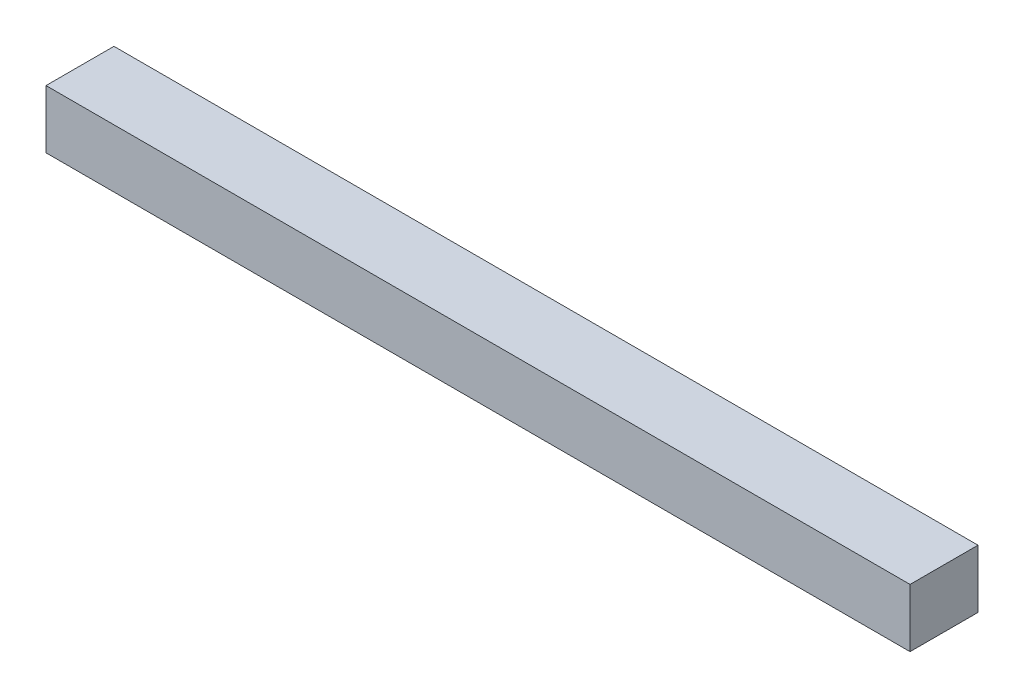
ISO-10303-21;
HEADER;
FILE_DESCRIPTION(('STEP AP214'),'2;1');
FILE_NAME('part.step','',(''),(''),'','','');
FILE_SCHEMA(('AUTOMOTIVE_DESIGN { 1 0 10303 214 1 1 1 1 }'));
ENDSEC;
DATA;
#1=APPLICATION_CONTEXT('core data for automotive mechanical design processes');
#2=APPLICATION_PROTOCOL_DEFINITION('international standard','automotive_design',2000,#1);
#3=PRODUCT_CONTEXT('',#1,'mechanical');
#4=PRODUCT('Part','Part','',(#3));
#5=PRODUCT_RELATED_PRODUCT_CATEGORY('part','',(#4));
#6=PRODUCT_DEFINITION_FORMATION('','',#4);
#7=PRODUCT_DEFINITION_CONTEXT('part definition',#1,'design');
#8=PRODUCT_DEFINITION('design','',#6,#7);
#9=PRODUCT_DEFINITION_SHAPE('','',#8);
#10=(LENGTH_UNIT() NAMED_UNIT(*) SI_UNIT(.MILLI.,.METRE.));
#11=(NAMED_UNIT(*) PLANE_ANGLE_UNIT() SI_UNIT($,.RADIAN.));
#12=(NAMED_UNIT(*) SI_UNIT($,.STERADIAN.) SOLID_ANGLE_UNIT());
#13=UNCERTAINTY_MEASURE_WITH_UNIT(LENGTH_MEASURE(1.E-05),#10,'distance_accuracy_value','');
#14=(GEOMETRIC_REPRESENTATION_CONTEXT(3) GLOBAL_UNCERTAINTY_ASSIGNED_CONTEXT((#13)) GLOBAL_UNIT_ASSIGNED_CONTEXT((#10,
#11,#12)) REPRESENTATION_CONTEXT('',''));
#15=CARTESIAN_POINT('',(0.,0.,0.));
#16=DIRECTION('',(0.,0.,1.));
#17=DIRECTION('',(1.,0.,0.));
#18=AXIS2_PLACEMENT_3D('',#15,#16,#17);
#19=CARTESIAN_POINT('',(262.47000879404,-3.23558340860733,79.7621896811064));
#20=DIRECTION('',(-1.,0.,0.));
#21=DIRECTION('',(0.,0.,1.));
#22=AXIS2_PLACEMENT_3D('',#19,#20,#21);
#23=PLANE('',#22);
#24=DIRECTION('',(0.,-1.,0.));
#25=VECTOR('',#24,1.);
#26=CARTESIAN_POINT('',(262.47000879404,-3.23558340860733,86.7621896811064));
#27=LINE('',#26,#25);
#28=CARTESIAN_POINT('',(262.47000879404,-3.23558340860733,86.7621896811064));
#29=VERTEX_POINT('',#28);
#30=CARTESIAN_POINT('',(262.47000879404,-9.23558340860733,86.7621896811064));
#31=VERTEX_POINT('',#30);
#32=EDGE_CURVE('E90',#29,#31,#27,.T.);
#33=ORIENTED_EDGE('',*,*,#32,.T.);
#34=DIRECTION('',(0.,0.,-1.));
#35=VECTOR('',#34,1.);
#36=CARTESIAN_POINT('',(262.47000879404,-9.23558340860733,79.7621896811064));
#37=LINE('',#36,#35);
#38=CARTESIAN_POINT('',(262.47000879404,-9.23558340860733,79.7621896811064));
#39=VERTEX_POINT('',#38);
#40=EDGE_CURVE('E85',#31,#39,#37,.T.);
#41=ORIENTED_EDGE('',*,*,#40,.T.);
#42=DIRECTION('',(0.,-1.,0.));
#43=VECTOR('',#42,1.);
#44=CARTESIAN_POINT('',(262.47000879404,-3.23558340860733,79.7621896811064));
#45=LINE('',#44,#43);
#46=CARTESIAN_POINT('',(262.47000879404,-3.23558340860733,79.7621896811064));
#47=VERTEX_POINT('',#46);
#48=EDGE_CURVE('E11',#47,#39,#45,.T.);
#49=ORIENTED_EDGE('',*,*,#48,.F.);
#50=DIRECTION('',(0.,0.,-1.));
#51=VECTOR('',#50,1.);
#52=CARTESIAN_POINT('',(262.47000879404,-3.23558340860733,79.7621896811064));
#53=LINE('',#52,#51);
#54=EDGE_CURVE('E96',#29,#47,#53,.T.);
#55=ORIENTED_EDGE('',*,*,#54,.F.);
#56=EDGE_LOOP('',(#33,#41,#49,#55));
#57=FACE_BOUND('',#56,.T.);
#58=ADVANCED_FACE('F33',(#57),#23,.F.);
#59=CARTESIAN_POINT('',(262.47000879404,-3.23558340860733,79.7621896811064));
#60=DIRECTION('',(0.,0.,1.));
#61=DIRECTION('',(1.,0.,0.));
#62=AXIS2_PLACEMENT_3D('',#59,#60,#61);
#63=PLANE('',#62);
#64=ORIENTED_EDGE('',*,*,#48,.T.);
#65=DIRECTION('',(-1.,0.,0.));
#66=VECTOR('',#65,1.);
#67=CARTESIAN_POINT('',(262.47000879404,-9.23558340860733,79.7621896811064));
#68=LINE('',#67,#66);
#69=CARTESIAN_POINT('',(173.47000879404,-9.23558340860733,79.7621896811065));
#70=VERTEX_POINT('',#69);
#71=EDGE_CURVE('E75',#39,#70,#68,.T.);
#72=ORIENTED_EDGE('',*,*,#71,.T.);
#73=DIRECTION('',(0.,-1.,0.));
#74=VECTOR('',#73,1.);
#75=CARTESIAN_POINT('',(173.47000879404,-3.23558340860733,79.7621896811065));
#76=LINE('',#75,#74);
#77=CARTESIAN_POINT('',(173.47000879404,-3.23558340860733,79.7621896811065));
#78=VERTEX_POINT('',#77);
#79=EDGE_CURVE('E40',#78,#70,#76,.T.);
#80=ORIENTED_EDGE('',*,*,#79,.F.);
#81=DIRECTION('',(-1.,0.,0.));
#82=VECTOR('',#81,1.);
#83=CARTESIAN_POINT('',(262.47000879404,-3.23558340860733,79.7621896811064));
#84=LINE('',#83,#82);
#85=EDGE_CURVE('E76',#47,#78,#84,.T.);
#86=ORIENTED_EDGE('',*,*,#85,.F.);
#87=EDGE_LOOP('',(#64,#72,#80,#86));
#88=FACE_BOUND('',#87,.T.);
#89=ADVANCED_FACE('F73',(#88),#63,.F.);
#90=CARTESIAN_POINT('',(173.47000879404,-3.23558340860733,79.7621896811065));
#91=DIRECTION('',(1.,0.,0.));
#92=DIRECTION('',(0.,0.,-1.));
#93=AXIS2_PLACEMENT_3D('',#90,#91,#92);
#94=PLANE('',#93);
#95=ORIENTED_EDGE('',*,*,#79,.T.);
#96=DIRECTION('',(0.,0.,1.));
#97=VECTOR('',#96,1.);
#98=CARTESIAN_POINT('',(173.47000879404,-9.23558340860733,79.7621896811065));
#99=LINE('',#98,#97);
#100=CARTESIAN_POINT('',(173.47000879404,-9.23558340860733,86.7621896811064));
#101=VERTEX_POINT('',#100);
#102=EDGE_CURVE('E88',#70,#101,#99,.T.);
#103=ORIENTED_EDGE('',*,*,#102,.T.);
#104=DIRECTION('',(0.,-1.,0.));
#105=VECTOR('',#104,1.);
#106=CARTESIAN_POINT('',(173.47000879404,-3.23558340860733,86.7621896811064));
#107=LINE('',#106,#105);
#108=CARTESIAN_POINT('',(173.47000879404,-3.23558340860733,86.7621896811064));
#109=VERTEX_POINT('',#108);
#110=EDGE_CURVE('E102',#109,#101,#107,.T.);
#111=ORIENTED_EDGE('',*,*,#110,.F.);
#112=DIRECTION('',(0.,0.,1.));
#113=VECTOR('',#112,1.);
#114=CARTESIAN_POINT('',(173.47000879404,-3.23558340860733,79.7621896811065));
#115=LINE('',#114,#113);
#116=EDGE_CURVE('E52',#78,#109,#115,.T.);
#117=ORIENTED_EDGE('',*,*,#116,.F.);
#118=EDGE_LOOP('',(#95,#103,#111,#117));
#119=FACE_BOUND('',#118,.T.);
#120=ADVANCED_FACE('F104',(#119),#94,.F.);
#121=CARTESIAN_POINT('',(262.47000879404,-3.23558340860733,86.7621896811064));
#122=DIRECTION('',(0.,0.,-1.));
#123=DIRECTION('',(-1.,0.,0.));
#124=AXIS2_PLACEMENT_3D('',#121,#122,#123);
#125=PLANE('',#124);
#126=ORIENTED_EDGE('',*,*,#110,.T.);
#127=DIRECTION('',(1.,0.,0.));
#128=VECTOR('',#127,1.);
#129=CARTESIAN_POINT('',(262.47000879404,-9.23558340860733,86.7621896811064));
#130=LINE('',#129,#128);
#131=EDGE_CURVE('E94',#101,#31,#130,.T.);
#132=ORIENTED_EDGE('',*,*,#131,.T.);
#133=ORIENTED_EDGE('',*,*,#32,.F.);
#134=DIRECTION('',(1.,0.,0.));
#135=VECTOR('',#134,1.);
#136=CARTESIAN_POINT('',(262.47000879404,-3.23558340860733,86.7621896811064));
#137=LINE('',#136,#135);
#138=EDGE_CURVE('E47',#109,#29,#137,.T.);
#139=ORIENTED_EDGE('',*,*,#138,.F.);
#140=EDGE_LOOP('',(#126,#132,#133,#139));
#141=FACE_BOUND('',#140,.T.);
#142=ADVANCED_FACE('F106',(#141),#125,.F.);
#143=CARTESIAN_POINT('',(0.,-3.23558340860733,0.));
#144=DIRECTION('',(0.,-1.,0.));
#145=DIRECTION('',(0.,0.,-1.));
#146=AXIS2_PLACEMENT_3D('',#143,#144,#145);
#147=PLANE('',#146);
#148=ORIENTED_EDGE('',*,*,#54,.T.);
#149=ORIENTED_EDGE('',*,*,#85,.T.);
#150=ORIENTED_EDGE('',*,*,#116,.T.);
#151=ORIENTED_EDGE('',*,*,#138,.T.);
#152=EDGE_LOOP('',(#148,#149,#150,#151));
#153=FACE_BOUND('',#152,.T.);
#154=ADVANCED_FACE('F107',(#153),#147,.F.);
#155=CARTESIAN_POINT('',(0.,-9.23558340860733,0.));
#156=DIRECTION('',(0.,-1.,0.));
#157=DIRECTION('',(0.,0.,-1.));
#158=AXIS2_PLACEMENT_3D('',#155,#156,#157);
#159=PLANE('',#158);
#160=ORIENTED_EDGE('',*,*,#40,.F.);
#161=ORIENTED_EDGE('',*,*,#131,.F.);
#162=ORIENTED_EDGE('',*,*,#102,.F.);
#163=ORIENTED_EDGE('',*,*,#71,.F.);
#164=EDGE_LOOP('',(#160,#161,#162,#163));
#165=FACE_BOUND('',#164,.T.);
#166=ADVANCED_FACE('F83',(#165),#159,.T.);
#167=CLOSED_SHELL('',(#58,#89,#120,#142,#154,#166));
#168=MANIFOLD_SOLID_BREP('B2',#167);
#169=ADVANCED_BREP_SHAPE_REPRESENTATION('',(#18,#168),#14);
#170=SHAPE_DEFINITION_REPRESENTATION(#9,#169);
ENDSEC;
END-ISO-10303-21;
